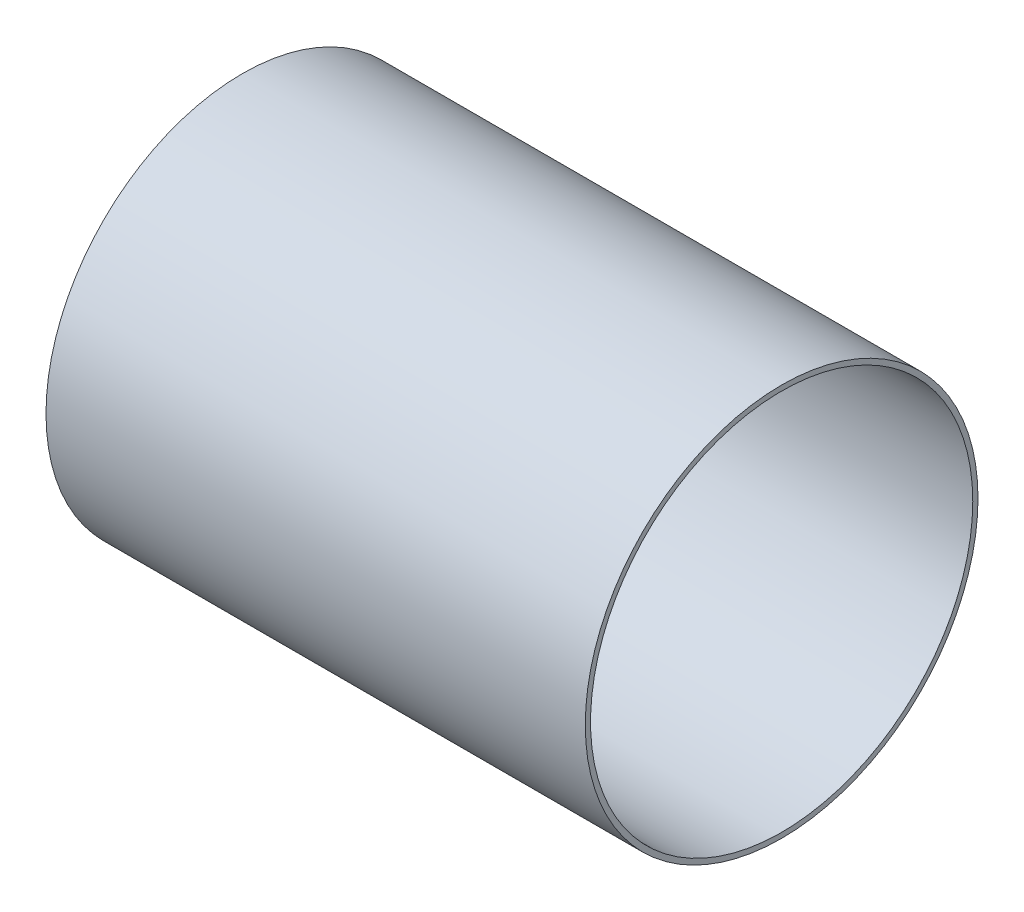
ISO-10303-21;
HEADER;
FILE_DESCRIPTION(('STEP AP214'),'2;1');
FILE_NAME('part.step','',(''),(''),'','','');
FILE_SCHEMA(('AUTOMOTIVE_DESIGN { 1 0 10303 214 1 1 1 1 }'));
ENDSEC;
DATA;
#1=APPLICATION_CONTEXT('core data for automotive mechanical design processes');
#2=APPLICATION_PROTOCOL_DEFINITION('international standard','automotive_design',2000,#1);
#3=PRODUCT_CONTEXT('',#1,'mechanical');
#4=PRODUCT('Part','Part','',(#3));
#5=PRODUCT_RELATED_PRODUCT_CATEGORY('part','',(#4));
#6=PRODUCT_DEFINITION_FORMATION('','',#4);
#7=PRODUCT_DEFINITION_CONTEXT('part definition',#1,'design');
#8=PRODUCT_DEFINITION('design','',#6,#7);
#9=PRODUCT_DEFINITION_SHAPE('','',#8);
#10=(LENGTH_UNIT() NAMED_UNIT(*) SI_UNIT(.MILLI.,.METRE.));
#11=(NAMED_UNIT(*) PLANE_ANGLE_UNIT() SI_UNIT($,.RADIAN.));
#12=(NAMED_UNIT(*) SI_UNIT($,.STERADIAN.) SOLID_ANGLE_UNIT());
#13=UNCERTAINTY_MEASURE_WITH_UNIT(LENGTH_MEASURE(1.E-05),#10,'distance_accuracy_value','');
#14=(GEOMETRIC_REPRESENTATION_CONTEXT(3) GLOBAL_UNCERTAINTY_ASSIGNED_CONTEXT((#13)) GLOBAL_UNIT_ASSIGNED_CONTEXT((#10,
#11,#12)) REPRESENTATION_CONTEXT('',''));
#15=CARTESIAN_POINT('',(0.,0.,0.));
#16=DIRECTION('',(0.,0.,1.));
#17=DIRECTION('',(1.,0.,0.));
#18=AXIS2_PLACEMENT_3D('',#15,#16,#17);
#19=CARTESIAN_POINT('',(206.,0.,0.));
#20=DIRECTION('',(1.,0.,0.));
#21=DIRECTION('',(0.,0.,-1.));
#22=AXIS2_PLACEMENT_3D('',#19,#20,#21);
#23=PLANE('',#22);
#24=CARTESIAN_POINT('',(206.,0.,0.));
#25=DIRECTION('',(1.,0.,0.));
#26=DIRECTION('',(0.,0.,-1.));
#27=AXIS2_PLACEMENT_3D('',#24,#25,#26);
#28=CIRCLE('',#27,75.);
#29=CARTESIAN_POINT('',(206.,0.,-75.));
#30=VERTEX_POINT('',#29);
#31=EDGE_CURVE('E10',#30,#30,#28,.T.);
#32=ORIENTED_EDGE('',*,*,#31,.T.);
#33=EDGE_LOOP('',(#32));
#34=FACE_BOUND('',#33,.T.);
#35=CARTESIAN_POINT('',(206.,0.,0.));
#36=DIRECTION('',(1.,0.,0.));
#37=DIRECTION('',(0.,0.,-1.));
#38=AXIS2_PLACEMENT_3D('',#35,#36,#37);
#39=CIRCLE('',#38,73.);
#40=CARTESIAN_POINT('',(206.,0.,-73.));
#41=VERTEX_POINT('',#40);
#42=EDGE_CURVE('E42',#41,#41,#39,.T.);
#43=ORIENTED_EDGE('',*,*,#42,.F.);
#44=EDGE_LOOP('',(#43));
#45=FACE_BOUND('',#44,.T.);
#46=ADVANCED_FACE('F31',(#34,#45),#23,.T.);
#47=CARTESIAN_POINT('',(0.,0.,0.));
#48=DIRECTION('',(1.,0.,0.));
#49=DIRECTION('',(0.,0.,-1.));
#50=AXIS2_PLACEMENT_3D('',#47,#48,#49);
#51=PLANE('',#50);
#52=CARTESIAN_POINT('',(0.,0.,0.));
#53=DIRECTION('',(1.,0.,0.));
#54=DIRECTION('',(0.,0.,-1.));
#55=AXIS2_PLACEMENT_3D('',#52,#53,#54);
#56=CIRCLE('',#55,75.);
#57=CARTESIAN_POINT('',(0.,0.,-75.));
#58=VERTEX_POINT('',#57);
#59=EDGE_CURVE('E35',#58,#58,#56,.T.);
#60=ORIENTED_EDGE('',*,*,#59,.F.);
#61=EDGE_LOOP('',(#60));
#62=FACE_BOUND('',#61,.T.);
#63=CARTESIAN_POINT('',(0.,0.,0.));
#64=DIRECTION('',(1.,0.,0.));
#65=DIRECTION('',(0.,0.,-1.));
#66=AXIS2_PLACEMENT_3D('',#63,#64,#65);
#67=CIRCLE('',#66,73.);
#68=CARTESIAN_POINT('',(0.,0.,-73.));
#69=VERTEX_POINT('',#68);
#70=EDGE_CURVE('E44',#69,#69,#67,.T.);
#71=ORIENTED_EDGE('',*,*,#70,.T.);
#72=EDGE_LOOP('',(#71));
#73=FACE_BOUND('',#72,.T.);
#74=ADVANCED_FACE('F54',(#62,#73),#51,.F.);
#75=CARTESIAN_POINT('',(206.,0.,0.));
#76=DIRECTION('',(-1.,0.,0.));
#77=DIRECTION('',(0.,0.,1.));
#78=AXIS2_PLACEMENT_3D('',#75,#76,#77);
#79=CYLINDRICAL_SURFACE('',#78,75.);
#80=ORIENTED_EDGE('',*,*,#31,.F.);
#81=EDGE_LOOP('',(#80));
#82=FACE_BOUND('',#81,.T.);
#83=ORIENTED_EDGE('',*,*,#59,.T.);
#84=EDGE_LOOP('',(#83));
#85=FACE_BOUND('',#84,.T.);
#86=ADVANCED_FACE('F33',(#82,#85),#79,.T.);
#87=CARTESIAN_POINT('',(206.,0.,0.));
#88=DIRECTION('',(-1.,0.,0.));
#89=DIRECTION('',(0.,0.,1.));
#90=AXIS2_PLACEMENT_3D('',#87,#88,#89);
#91=CYLINDRICAL_SURFACE('',#90,73.);
#92=ORIENTED_EDGE('',*,*,#42,.T.);
#93=EDGE_LOOP('',(#92));
#94=FACE_BOUND('',#93,.T.);
#95=ORIENTED_EDGE('',*,*,#70,.F.);
#96=EDGE_LOOP('',(#95));
#97=FACE_BOUND('',#96,.T.);
#98=ADVANCED_FACE('F50',(#94,#97),#91,.F.);
#99=CLOSED_SHELL('',(#46,#74,#86,#98));
#100=MANIFOLD_SOLID_BREP('B2',#99);
#101=ADVANCED_BREP_SHAPE_REPRESENTATION('',(#18,#100),#14);
#102=SHAPE_DEFINITION_REPRESENTATION(#9,#101);
ENDSEC;
END-ISO-10303-21;
